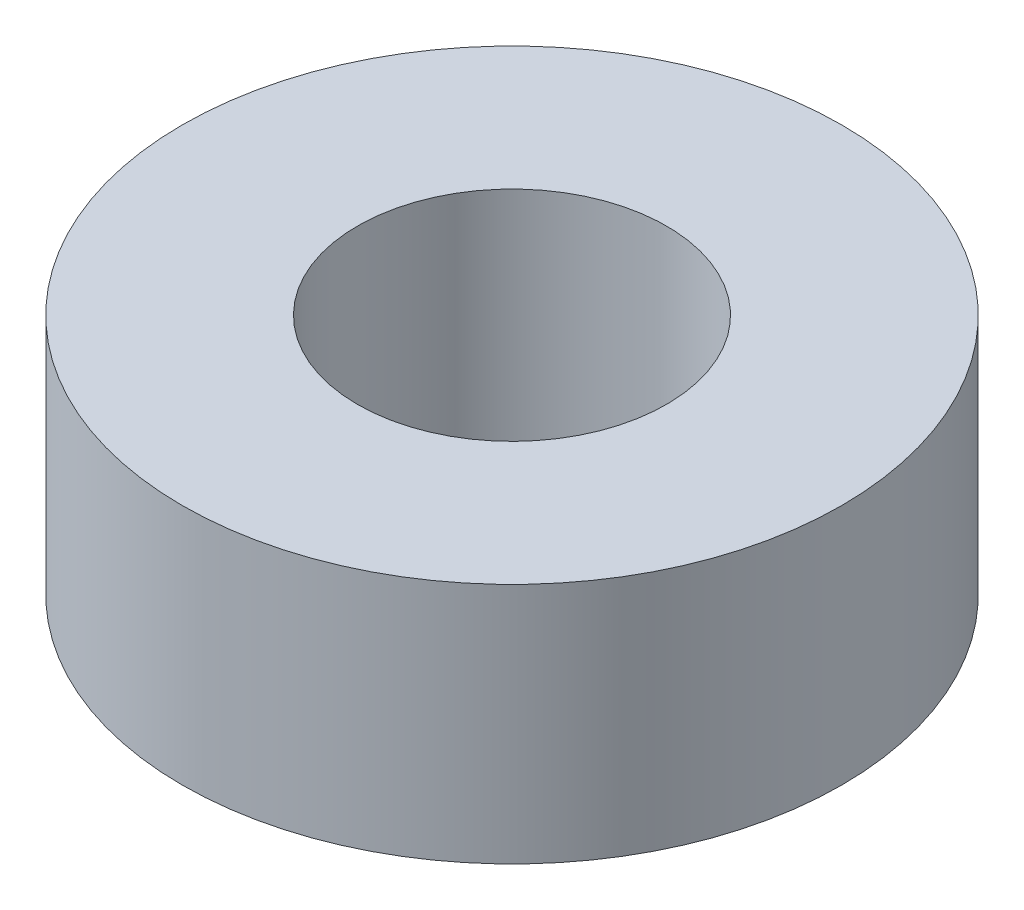
ISO-10303-21;
HEADER;
FILE_DESCRIPTION(('STEP AP214'),'2;1');
FILE_NAME('part.step','',(''),(''),'','','');
FILE_SCHEMA(('AUTOMOTIVE_DESIGN { 1 0 10303 214 1 1 1 1 }'));
ENDSEC;
DATA;
#1=APPLICATION_CONTEXT('core data for automotive mechanical design processes');
#2=APPLICATION_PROTOCOL_DEFINITION('international standard','automotive_design',2000,#1);
#3=PRODUCT_CONTEXT('',#1,'mechanical');
#4=PRODUCT('Part','Part','',(#3));
#5=PRODUCT_RELATED_PRODUCT_CATEGORY('part','',(#4));
#6=PRODUCT_DEFINITION_FORMATION('','',#4);
#7=PRODUCT_DEFINITION_CONTEXT('part definition',#1,'design');
#8=PRODUCT_DEFINITION('design','',#6,#7);
#9=PRODUCT_DEFINITION_SHAPE('','',#8);
#10=(LENGTH_UNIT() NAMED_UNIT(*) SI_UNIT(.MILLI.,.METRE.));
#11=(NAMED_UNIT(*) PLANE_ANGLE_UNIT() SI_UNIT($,.RADIAN.));
#12=(NAMED_UNIT(*) SI_UNIT($,.STERADIAN.) SOLID_ANGLE_UNIT());
#13=UNCERTAINTY_MEASURE_WITH_UNIT(LENGTH_MEASURE(1.E-05),#10,'distance_accuracy_value','');
#14=(GEOMETRIC_REPRESENTATION_CONTEXT(3) GLOBAL_UNCERTAINTY_ASSIGNED_CONTEXT((#13)) GLOBAL_UNIT_ASSIGNED_CONTEXT((#10,
#11,#12)) REPRESENTATION_CONTEXT('',''));
#15=CARTESIAN_POINT('',(0.,0.,0.));
#16=DIRECTION('',(0.,0.,1.));
#17=DIRECTION('',(1.,0.,0.));
#18=AXIS2_PLACEMENT_3D('',#15,#16,#17);
#19=CARTESIAN_POINT('',(0.,2.35,0.));
#20=DIRECTION('',(0.,1.,0.));
#21=DIRECTION('',(0.,0.,1.));
#22=AXIS2_PLACEMENT_3D('',#19,#20,#21);
#23=PLANE('',#22);
#24=CARTESIAN_POINT('',(0.,2.35,0.));
#25=DIRECTION('',(0.,1.,0.));
#26=DIRECTION('',(0.,0.,1.));
#27=AXIS2_PLACEMENT_3D('',#24,#25,#26);
#28=CIRCLE('',#27,3.2);
#29=CARTESIAN_POINT('',(0.,2.35,3.2));
#30=VERTEX_POINT('',#29);
#31=EDGE_CURVE('E10',#30,#30,#28,.T.);
#32=ORIENTED_EDGE('',*,*,#31,.T.);
#33=EDGE_LOOP('',(#32));
#34=FACE_BOUND('',#33,.T.);
#35=CARTESIAN_POINT('',(0.,2.35,0.));
#36=DIRECTION('',(0.,1.,0.));
#37=DIRECTION('',(0.,0.,1.));
#38=AXIS2_PLACEMENT_3D('',#35,#36,#37);
#39=CIRCLE('',#38,1.5);
#40=CARTESIAN_POINT('',(0.,2.35,1.5));
#41=VERTEX_POINT('',#40);
#42=EDGE_CURVE('E42',#41,#41,#39,.T.);
#43=ORIENTED_EDGE('',*,*,#42,.F.);
#44=EDGE_LOOP('',(#43));
#45=FACE_BOUND('',#44,.T.);
#46=ADVANCED_FACE('F31',(#34,#45),#23,.T.);
#47=CARTESIAN_POINT('',(0.,0.,0.));
#48=DIRECTION('',(0.,1.,0.));
#49=DIRECTION('',(0.,0.,1.));
#50=AXIS2_PLACEMENT_3D('',#47,#48,#49);
#51=PLANE('',#50);
#52=CARTESIAN_POINT('',(0.,0.,0.));
#53=DIRECTION('',(0.,1.,0.));
#54=DIRECTION('',(0.,0.,1.));
#55=AXIS2_PLACEMENT_3D('',#52,#53,#54);
#56=CIRCLE('',#55,3.2);
#57=CARTESIAN_POINT('',(0.,0.,3.2));
#58=VERTEX_POINT('',#57);
#59=EDGE_CURVE('E35',#58,#58,#56,.T.);
#60=ORIENTED_EDGE('',*,*,#59,.F.);
#61=EDGE_LOOP('',(#60));
#62=FACE_BOUND('',#61,.T.);
#63=CARTESIAN_POINT('',(0.,0.,0.));
#64=DIRECTION('',(0.,1.,0.));
#65=DIRECTION('',(0.,0.,1.));
#66=AXIS2_PLACEMENT_3D('',#63,#64,#65);
#67=CIRCLE('',#66,1.5);
#68=CARTESIAN_POINT('',(0.,0.,1.5));
#69=VERTEX_POINT('',#68);
#70=EDGE_CURVE('E44',#69,#69,#67,.T.);
#71=ORIENTED_EDGE('',*,*,#70,.T.);
#72=EDGE_LOOP('',(#71));
#73=FACE_BOUND('',#72,.T.);
#74=ADVANCED_FACE('F54',(#62,#73),#51,.F.);
#75=CARTESIAN_POINT('',(0.,2.35,0.));
#76=DIRECTION('',(0.,-1.,0.));
#77=DIRECTION('',(0.,0.,-1.));
#78=AXIS2_PLACEMENT_3D('',#75,#76,#77);
#79=CYLINDRICAL_SURFACE('',#78,3.2);
#80=ORIENTED_EDGE('',*,*,#31,.F.);
#81=EDGE_LOOP('',(#80));
#82=FACE_BOUND('',#81,.T.);
#83=ORIENTED_EDGE('',*,*,#59,.T.);
#84=EDGE_LOOP('',(#83));
#85=FACE_BOUND('',#84,.T.);
#86=ADVANCED_FACE('F33',(#82,#85),#79,.T.);
#87=CARTESIAN_POINT('',(0.,2.35,0.));
#88=DIRECTION('',(0.,-1.,0.));
#89=DIRECTION('',(0.,0.,-1.));
#90=AXIS2_PLACEMENT_3D('',#87,#88,#89);
#91=CYLINDRICAL_SURFACE('',#90,1.5);
#92=ORIENTED_EDGE('',*,*,#42,.T.);
#93=EDGE_LOOP('',(#92));
#94=FACE_BOUND('',#93,.T.);
#95=ORIENTED_EDGE('',*,*,#70,.F.);
#96=EDGE_LOOP('',(#95));
#97=FACE_BOUND('',#96,.T.);
#98=ADVANCED_FACE('F50',(#94,#97),#91,.F.);
#99=CLOSED_SHELL('',(#46,#74,#86,#98));
#100=MANIFOLD_SOLID_BREP('B2',#99);
#101=ADVANCED_BREP_SHAPE_REPRESENTATION('',(#18,#100),#14);
#102=SHAPE_DEFINITION_REPRESENTATION(#9,#101);
ENDSEC;
END-ISO-10303-21;
